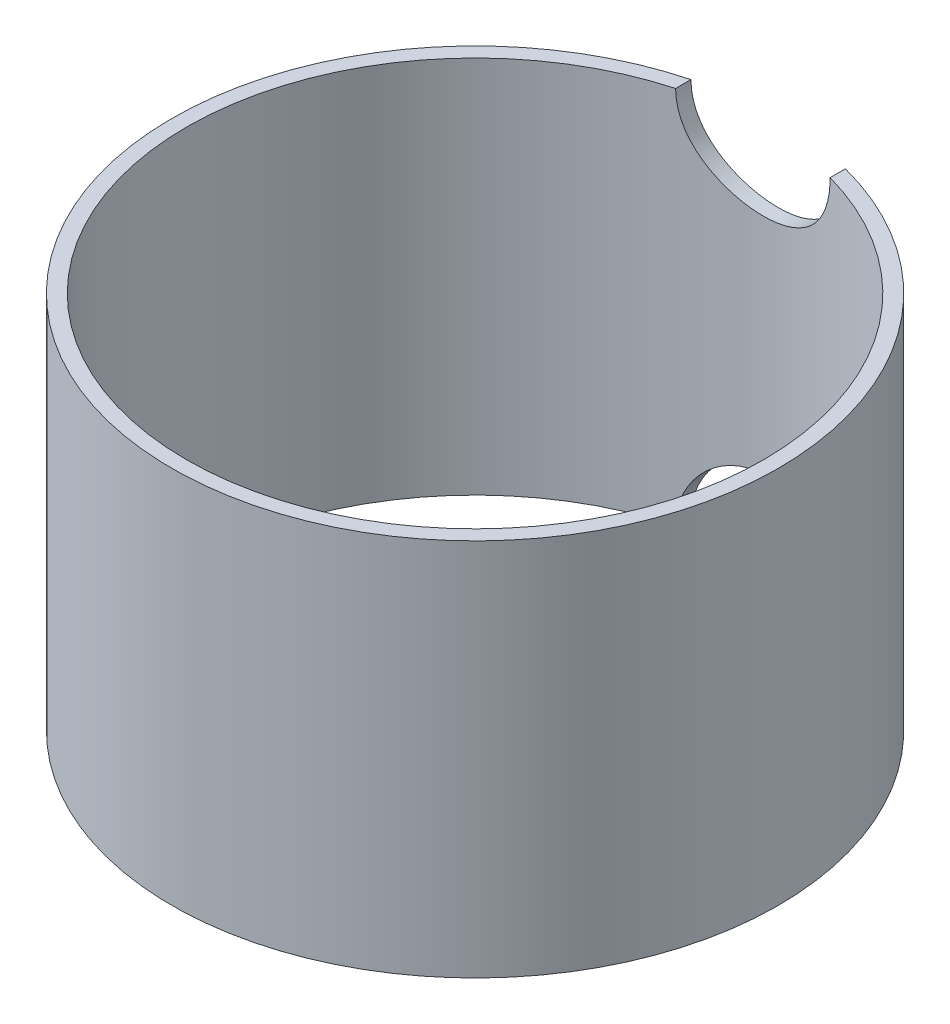
ISO-10303-21;
HEADER;
FILE_DESCRIPTION(('STEP AP214'),'2;1');
FILE_NAME('part.step','',(''),(''),'','','');
FILE_SCHEMA(('AUTOMOTIVE_DESIGN { 1 0 10303 214 1 1 1 1 }'));
ENDSEC;
DATA;
#1=APPLICATION_CONTEXT('core data for automotive mechanical design processes');
#2=APPLICATION_PROTOCOL_DEFINITION('international standard','automotive_design',2000,#1);
#3=PRODUCT_CONTEXT('',#1,'mechanical');
#4=PRODUCT('Part','Part','',(#3));
#5=PRODUCT_RELATED_PRODUCT_CATEGORY('part','',(#4));
#6=PRODUCT_DEFINITION_FORMATION('','',#4);
#7=PRODUCT_DEFINITION_CONTEXT('part definition',#1,'design');
#8=PRODUCT_DEFINITION('design','',#6,#7);
#9=PRODUCT_DEFINITION_SHAPE('','',#8);
#10=(LENGTH_UNIT() NAMED_UNIT(*) SI_UNIT(.MILLI.,.METRE.));
#11=(NAMED_UNIT(*) PLANE_ANGLE_UNIT() SI_UNIT($,.RADIAN.));
#12=(NAMED_UNIT(*) SI_UNIT($,.STERADIAN.) SOLID_ANGLE_UNIT());
#13=UNCERTAINTY_MEASURE_WITH_UNIT(LENGTH_MEASURE(1.E-05),#10,'distance_accuracy_value','');
#14=(GEOMETRIC_REPRESENTATION_CONTEXT(3) GLOBAL_UNCERTAINTY_ASSIGNED_CONTEXT((#13)) GLOBAL_UNIT_ASSIGNED_CONTEXT((#10,
#11,#12)) REPRESENTATION_CONTEXT('',''));
#15=CARTESIAN_POINT('',(0.,0.,0.));
#16=DIRECTION('',(0.,0.,1.));
#17=DIRECTION('',(1.,0.,0.));
#18=AXIS2_PLACEMENT_3D('',#15,#16,#17);
#19=CARTESIAN_POINT('',(0.,51.2,0.));
#20=DIRECTION('',(0.,1.,0.));
#21=DIRECTION('',(0.,0.,1.));
#22=AXIS2_PLACEMENT_3D('',#19,#20,#21);
#23=PLANE('',#22);
#24=DIRECTION('',(0.,0.,1.));
#25=VECTOR('',#24,1.);
#26=CARTESIAN_POINT('',(-10.45,51.2,-41.));
#27=LINE('',#26,#25);
#28=CARTESIAN_POINT('',(-10.45,51.2,-39.645901427512));
#29=VERTEX_POINT('',#28);
#30=CARTESIAN_POINT('',(-10.45,51.2,-37.5738938626275));
#31=VERTEX_POINT('',#30);
#32=EDGE_CURVE('E62',#29,#31,#27,.T.);
#33=ORIENTED_EDGE('',*,*,#32,.F.);
#34=CARTESIAN_POINT('',(0.,51.2,0.));
#35=DIRECTION('',(0.,1.,0.));
#36=DIRECTION('',(0.,0.,1.));
#37=AXIS2_PLACEMENT_3D('',#34,#35,#36);
#38=CIRCLE('',#37,41.);
#39=CARTESIAN_POINT('',(10.45,51.2,-39.645901427512));
#40=VERTEX_POINT('',#39);
#41=EDGE_CURVE('E85',#29,#40,#38,.T.);
#42=ORIENTED_EDGE('',*,*,#41,.T.);
#43=DIRECTION('',(0.,0.,1.));
#44=VECTOR('',#43,1.);
#45=CARTESIAN_POINT('',(10.45,51.2,-41.));
#46=LINE('',#45,#44);
#47=CARTESIAN_POINT('',(10.45,51.2,-37.5738938626275));
#48=VERTEX_POINT('',#47);
#49=EDGE_CURVE('E121',#48,#40,#46,.F.);
#50=ORIENTED_EDGE('',*,*,#49,.F.);
#51=CARTESIAN_POINT('',(0.,51.2,0.));
#52=DIRECTION('',(0.,1.,0.));
#53=DIRECTION('',(0.,0.,1.));
#54=AXIS2_PLACEMENT_3D('',#51,#52,#53);
#55=CIRCLE('',#54,39.);
#56=EDGE_CURVE('E94',#31,#48,#55,.T.);
#57=ORIENTED_EDGE('',*,*,#56,.F.);
#58=EDGE_LOOP('',(#33,#42,#50,#57));
#59=FACE_BOUND('',#58,.T.);
#60=ADVANCED_FACE('F33',(#59),#23,.T.);
#61=CARTESIAN_POINT('',(0.,0.,0.));
#62=DIRECTION('',(0.,1.,0.));
#63=DIRECTION('',(0.,0.,1.));
#64=AXIS2_PLACEMENT_3D('',#61,#62,#63);
#65=PLANE('',#64);
#66=CARTESIAN_POINT('',(0.,0.,0.));
#67=DIRECTION('',(0.,1.,0.));
#68=DIRECTION('',(0.,0.,1.));
#69=AXIS2_PLACEMENT_3D('',#66,#67,#68);
#70=CIRCLE('',#69,41.);
#71=CARTESIAN_POINT('',(-10.45,0.,-39.645901427512));
#72=VERTEX_POINT('',#71);
#73=CARTESIAN_POINT('',(10.45,0.,-39.645901427512));
#74=VERTEX_POINT('',#73);
#75=EDGE_CURVE('E90',#72,#74,#70,.T.);
#76=ORIENTED_EDGE('',*,*,#75,.F.);
#77=DIRECTION('',(0.,0.,1.));
#78=VECTOR('',#77,1.);
#79=CARTESIAN_POINT('',(-10.45,0.,-41.));
#80=LINE('',#79,#78);
#81=CARTESIAN_POINT('',(-10.45,0.,-37.5738938626275));
#82=VERTEX_POINT('',#81);
#83=EDGE_CURVE('E80',#72,#82,#80,.T.);
#84=ORIENTED_EDGE('',*,*,#83,.T.);
#85=CARTESIAN_POINT('',(0.,0.,0.));
#86=DIRECTION('',(0.,1.,0.));
#87=DIRECTION('',(0.,0.,1.));
#88=AXIS2_PLACEMENT_3D('',#85,#86,#87);
#89=CIRCLE('',#88,39.);
#90=CARTESIAN_POINT('',(10.45,0.,-37.5738938626275));
#91=VERTEX_POINT('',#90);
#92=EDGE_CURVE('E88',#82,#91,#89,.T.);
#93=ORIENTED_EDGE('',*,*,#92,.T.);
#94=DIRECTION('',(0.,0.,1.));
#95=VECTOR('',#94,1.);
#96=CARTESIAN_POINT('',(10.45,0.,-41.));
#97=LINE('',#96,#95);
#98=EDGE_CURVE('E55',#91,#74,#97,.F.);
#99=ORIENTED_EDGE('',*,*,#98,.T.);
#100=EDGE_LOOP('',(#76,#84,#93,#99));
#101=FACE_BOUND('',#100,.T.);
#102=ADVANCED_FACE('F87',(#101),#65,.F.);
#103=CARTESIAN_POINT('',(0.,51.2,0.));
#104=DIRECTION('',(0.,-1.,0.));
#105=DIRECTION('',(0.,0.,-1.));
#106=AXIS2_PLACEMENT_3D('',#103,#104,#105);
#107=CYLINDRICAL_SURFACE('',#106,41.);
#108=ORIENTED_EDGE('',*,*,#41,.F.);
#109=CARTESIAN_POINT('',(-10.45,51.2,-39.645901427512));
#110=CARTESIAN_POINT('',(-10.4500368438836,50.9112052604951,-39.6458673603376));
#111=CARTESIAN_POINT('',(-10.4380300101083,50.6224224584076,-39.6490558010595));
#112=CARTESIAN_POINT('',(-10.3902001444511,50.0470202026528,-39.6616296629602));
#113=CARTESIAN_POINT('',(-10.3543812384641,49.7604003829073,-39.6710140105781));
#114=CARTESIAN_POINT('',(-10.2592945990659,49.1919382980589,-39.6957067801007));
#115=CARTESIAN_POINT('',(-10.2000745031508,48.9100875326951,-39.71100316557));
#116=CARTESIAN_POINT('',(-10.0586911320703,48.3525576093135,-39.7470512718942));
#117=CARTESIAN_POINT('',(-9.97652751652669,48.0768785429214,-39.7678030736826));
#118=CARTESIAN_POINT('',(-9.78994846095404,47.5336864705125,-39.8141448004812));
#119=CARTESIAN_POINT('',(-9.6855406114894,47.2661707143794,-39.8397330747708));
#120=CARTESIAN_POINT('',(-9.45521632135085,46.7408903456132,-39.8950236129089));
#121=CARTESIAN_POINT('',(-9.32929179059307,46.4831294454109,-39.9247274233655));
#122=CARTESIAN_POINT('',(-9.05690279276873,45.9791721920817,-39.987398369575));
#123=CARTESIAN_POINT('',(-8.91044154116916,45.7329740365979,-40.0203649942267));
#124=CARTESIAN_POINT('',(-8.59791187283406,45.2535444283777,-40.088670455776));
#125=CARTESIAN_POINT('',(-8.43183448330955,45.0203189819078,-40.1240103750495));
#126=CARTESIAN_POINT('',(-8.07763531389647,44.56377522658,-40.196830133563));
#127=CARTESIAN_POINT('',(-7.88913164319508,44.3407577393893,-40.234338979343));
#128=CARTESIAN_POINT('',(-7.49425670673086,43.9114027474804,-40.3097567874696));
#129=CARTESIAN_POINT('',(-7.28789316603187,43.7050581050729,-40.3476655706594));
#130=CARTESIAN_POINT('',(-6.8584514481281,43.3101788455125,-40.4228793953211));
#131=CARTESIAN_POINT('',(-6.63536381707102,43.1216544400603,-40.4601840805966));
#132=CARTESIAN_POINT('',(-6.17411038141599,42.7638861146497,-40.5331327472467));
#133=CARTESIAN_POINT('',(-5.93595027730379,42.5946349724423,-40.5687773477242));
#134=CARTESIAN_POINT('',(-5.44240328793721,42.274161742658,-40.6379531803324));
#135=CARTESIAN_POINT('',(-5.18681396053993,42.1232427717348,-40.6714454351166));
#136=CARTESIAN_POINT('',(-4.66336344310647,41.8435262277956,-40.7347828592638));
#137=CARTESIAN_POINT('',(-4.39550209647532,41.714728937159,-40.7646279820703));
#138=CARTESIAN_POINT('',(-3.84942935533693,41.4802950055813,-40.8198135830379));
#139=CARTESIAN_POINT('',(-3.57121970225033,41.3746544882415,-40.8451548150069));
#140=CARTESIAN_POINT('',(-3.00641768536695,41.187384769855,-40.8906065529402));
#141=CARTESIAN_POINT('',(-2.71982552510235,41.1057549863449,-40.9107171857892));
#142=CARTESIAN_POINT('',(-2.14647395602521,40.968665848,-40.9447601292532));
#143=CARTESIAN_POINT('',(-1.85984450341102,40.9126928069987,-40.9588133406824));
#144=CARTESIAN_POINT('',(-1.28267980982847,40.8249128268876,-40.9809483195822));
#145=CARTESIAN_POINT('',(-0.992144618224663,40.7931055826386,-40.9890301624527));
#146=CARTESIAN_POINT('',(-0.409357337753071,40.7539379778427,-40.9989920863706));
#147=CARTESIAN_POINT('',(-0.11710544385622,40.7465748928941,-41.0008728585527));
#148=CARTESIAN_POINT('',(0.466959268206283,40.7563534868606,-40.9983808106222));
#149=CARTESIAN_POINT('',(0.758772092001783,40.7734948488473,-40.9940080713895));
#150=CARTESIAN_POINT('',(1.33306338718484,40.8314511823888,-40.9793062984528));
#151=CARTESIAN_POINT('',(1.61560176819125,40.8717101486429,-40.9691171880145));
#152=CARTESIAN_POINT('',(2.17618838022974,40.9751312748661,-40.9431671621998));
#153=CARTESIAN_POINT('',(2.45423669213015,41.0382930218634,-40.9274063472897));
#154=CARTESIAN_POINT('',(3.0039335559681,41.1870105109195,-40.8907357580868));
#155=CARTESIAN_POINT('',(3.27558195151647,41.2725667995967,-40.8698258581128));
#156=CARTESIAN_POINT('',(3.81064880176692,41.4654054893222,-40.8234133585548));
#157=CARTESIAN_POINT('',(4.07406713611667,41.5726882079154,-40.7979106918452));
#158=CARTESIAN_POINT('',(4.59330956807969,41.8092522749408,-40.7427330805346));
#159=CARTESIAN_POINT('',(4.84904243538839,41.9387254266181,-40.7130221876318));
#160=CARTESIAN_POINT('',(5.34880281689805,42.2180853724138,-40.6503845271063));
#161=CARTESIAN_POINT('',(5.59282624526163,42.3679792229951,-40.6174566489577));
#162=CARTESIAN_POINT('',(6.06752137923254,42.6870995238963,-40.5492624752319));
#163=CARTESIAN_POINT('',(6.29819367604059,42.8563251172001,-40.513996283346));
#164=CARTESIAN_POINT('',(6.74476459762284,43.2129908961554,-40.4420488243379));
#165=CARTESIAN_POINT('',(6.96066291731456,43.4004314577525,-40.4053675280182));
#166=CARTESIAN_POINT('',(7.38220696633468,43.7978532389637,-40.3305112330858));
#167=CARTESIAN_POINT('',(7.58739198178297,44.0083209914532,-40.2923232799351));
#168=CARTESIAN_POINT('',(7.97929785420182,44.445777547647,-40.2165468372802));
#169=CARTESIAN_POINT('',(8.16602433951857,44.6727612784481,-40.1789581679935));
#170=CARTESIAN_POINT('',(8.51989710492811,45.1419288101288,-40.1054115787501));
#171=CARTESIAN_POINT('',(8.68703438068663,45.3841195230781,-40.0694544133447));
#172=CARTESIAN_POINT('',(9.00044097122405,45.8820035386886,-40.0002228413847));
#173=CARTESIAN_POINT('',(9.14671094345448,46.1376964155986,-39.9669483503232));
#174=CARTESIAN_POINT('',(9.4180919156905,46.6624026629019,-39.9038729525829));
#175=CARTESIAN_POINT('',(9.54307485926258,46.9314848780428,-39.8740933819395));
#176=CARTESIAN_POINT('',(9.76984382352378,47.4796996933297,-39.8191382753024));
#177=CARTESIAN_POINT('',(9.87163087619826,47.7588318457138,-39.793962534494));
#178=CARTESIAN_POINT('',(10.0510573661207,48.3248010555536,-39.749022657032));
#179=CARTESIAN_POINT('',(10.1287260750808,48.6116283105045,-39.7292519639487));
#180=CARTESIAN_POINT('',(10.2593799182673,49.1910753064094,-39.695713469014));
#181=CARTESIAN_POINT('',(10.3123765990126,49.483692270797,-39.681942859315));
#182=CARTESIAN_POINT('',(10.3851732873343,50.0137306686374,-39.6629465784739));
#183=CARTESIAN_POINT('',(10.4094899513117,50.2505009897932,-39.6565634554929));
#184=CARTESIAN_POINT('',(10.4418972787809,50.7248409848075,-39.6480369867694));
#185=CARTESIAN_POINT('',(10.4500140403579,50.9624087543712,-39.6458868217967));
#186=CARTESIAN_POINT('',(10.45,51.2,-39.645901427512));
#187=B_SPLINE_CURVE_WITH_KNOTS('',3,(#109,#110,#111,#112,#113,#114,#115,#116,#117,#118,#119,
#120,#121,#122,#123,#124,#125,#126,#127,#128,#129,#130,#131,#132,#133,#134,#135,#136,#137,#138,
#139,#140,#141,#142,#143,#144,#145,#146,#147,#148,#149,#150,#151,#152,#153,#154,#155,#156,#157,
#158,#159,#160,#161,#162,#163,#164,#165,#166,#167,#168,#169,#170,#171,#172,#173,#174,#175,#176,
#177,#178,#179,#180,#181,#182,#183,#184,#185,#186),.UNSPECIFIED.,.F.,.F.,(4,2,2,2,2,2,2,2,2,2,2,
2,2,2,2,2,2,2,2,2,2,2,2,2,2,2,2,2,2,2,2,2,2,2,2,2,2,2,4),(0.,0.866098913349945,1.73204779767159,
2.59624288810411,3.46045079997393,4.32436428277422,5.18860330713596,6.05270716700357,
6.9172078261263,7.7994179740568,8.6812484220814,9.56358116869111,10.4455821840423,
11.340606711544,12.2356426630338,13.1305286726455,14.0253929719091,14.9014609538454,
15.7775178735676,16.653477149878,17.5294250970688,18.3851387140813,19.2408369020506,
20.0965559783279,20.9522875623638,21.8158276420485,22.6796668823168,23.5434678416574,
24.407286633101,25.295461257298,26.1833642198615,27.0716737265295,27.959955239668,
28.853404868785,29.7468147405574,30.6391360308962,31.531039293664,32.2447706514485,
32.9573512550355),.UNSPECIFIED.);
#188=EDGE_CURVE('E95',#29,#40,#187,.T.);
#189=ORIENTED_EDGE('',*,*,#188,.T.);
#190=EDGE_LOOP('',(#108,#189));
#191=FACE_BOUND('',#190,.T.);
#192=ORIENTED_EDGE('',*,*,#75,.T.);
#193=CARTESIAN_POINT('',(10.45,0.,-39.645901427512));
#194=CARTESIAN_POINT('',(10.4500368438836,0.288794739504853,-39.6458673603376));
#195=CARTESIAN_POINT('',(10.4380300101083,0.577577541592381,-39.6490558010595));
#196=CARTESIAN_POINT('',(10.3902001444511,1.15297979734717,-39.6616296629602));
#197=CARTESIAN_POINT('',(10.3543812384641,1.43959961709271,-39.6710140105781));
#198=CARTESIAN_POINT('',(10.2592945990659,2.00806170194108,-39.6957067801007));
#199=CARTESIAN_POINT('',(10.2000745031508,2.28991246730492,-39.71100316557));
#200=CARTESIAN_POINT('',(10.0586911320703,2.84744239068655,-39.7470512718942));
#201=CARTESIAN_POINT('',(9.97652751652669,3.12312145707862,-39.7678030736826));
#202=CARTESIAN_POINT('',(9.78994846095404,3.66631352948751,-39.8141448004812));
#203=CARTESIAN_POINT('',(9.6855406114894,3.93382928562062,-39.8397330747708));
#204=CARTESIAN_POINT('',(9.45521632135085,4.45910965438679,-39.8950236129089));
#205=CARTESIAN_POINT('',(9.32929179059307,4.71687055458913,-39.9247274233655));
#206=CARTESIAN_POINT('',(9.05690279276873,5.22082780791828,-39.987398369575));
#207=CARTESIAN_POINT('',(8.91044154116916,5.4670259634021,-40.0203649942267));
#208=CARTESIAN_POINT('',(8.59791187283407,5.94645557162233,-40.088670455776));
#209=CARTESIAN_POINT('',(8.43183448330955,6.17968101809217,-40.1240103750495));
#210=CARTESIAN_POINT('',(8.07763531389647,6.63622477342002,-40.196830133563));
#211=CARTESIAN_POINT('',(7.88913164319508,6.85924226061073,-40.234338979343));
#212=CARTESIAN_POINT('',(7.49425670673087,7.28859725251964,-40.3097567874696));
#213=CARTESIAN_POINT('',(7.28789316603187,7.49494189492715,-40.3476655706594));
#214=CARTESIAN_POINT('',(6.8584514481281,7.8898211544875,-40.4228793953211));
#215=CARTESIAN_POINT('',(6.63536381707103,8.07834555993972,-40.4601840805966));
#216=CARTESIAN_POINT('',(6.174110381416,8.43611388535035,-40.5331327472467));
#217=CARTESIAN_POINT('',(5.93595027730379,8.60536502755768,-40.5687773477242));
#218=CARTESIAN_POINT('',(5.44240328793721,8.92583825734205,-40.6379531803324));
#219=CARTESIAN_POINT('',(5.18681396053993,9.07675722826524,-40.6714454351166));
#220=CARTESIAN_POINT('',(4.66336344310647,9.35647377220445,-40.7347828592638));
#221=CARTESIAN_POINT('',(4.39550209647532,9.48527106284097,-40.7646279820703));
#222=CARTESIAN_POINT('',(3.84942935533693,9.71970499441874,-40.8198135830379));
#223=CARTESIAN_POINT('',(3.57121970225033,9.82534551175852,-40.8451548150069));
#224=CARTESIAN_POINT('',(3.00641768536695,10.012615230145,-40.8906065529402));
#225=CARTESIAN_POINT('',(2.71982552510235,10.0942450136552,-40.9107171857892));
#226=CARTESIAN_POINT('',(2.14647395602521,10.231334152,-40.9447601292532));
#227=CARTESIAN_POINT('',(1.85984450341102,10.2873071930013,-40.9588133406824));
#228=CARTESIAN_POINT('',(1.28267980982847,10.3750871731124,-40.9809483195822));
#229=CARTESIAN_POINT('',(0.992144618224661,10.4068944173614,-40.9890301624527));
#230=CARTESIAN_POINT('',(0.409357337753068,10.4460620221573,-40.9989920863706));
#231=CARTESIAN_POINT('',(0.117105443856216,10.4534251071059,-41.0008728585527));
#232=CARTESIAN_POINT('',(-0.466959268206286,10.4436465131394,-40.9983808106222));
#233=CARTESIAN_POINT('',(-0.758772092001787,10.4265051511527,-40.9940080713895));
#234=CARTESIAN_POINT('',(-1.33306338718485,10.3685488176112,-40.9793062984528));
#235=CARTESIAN_POINT('',(-1.61560176819125,10.3282898513571,-40.9691171880145));
#236=CARTESIAN_POINT('',(-2.17618838022974,10.2248687251339,-40.9431671621998));
#237=CARTESIAN_POINT('',(-2.45423669213014,10.1617069781366,-40.9274063472897));
#238=CARTESIAN_POINT('',(-3.0039335559681,10.0129894890805,-40.8907357580868));
#239=CARTESIAN_POINT('',(-3.27558195151648,9.92743320040326,-40.8698258581128));
#240=CARTESIAN_POINT('',(-3.81064880176692,9.73459451067779,-40.8234133585548));
#241=CARTESIAN_POINT('',(-4.07406713611667,9.62731179208457,-40.7979106918452));
#242=CARTESIAN_POINT('',(-4.5933095680797,9.39074772505925,-40.7427330805346));
#243=CARTESIAN_POINT('',(-4.84904243538839,9.26127457338186,-40.7130221876318));
#244=CARTESIAN_POINT('',(-5.34880281689806,8.98191462758621,-40.6503845271063));
#245=CARTESIAN_POINT('',(-5.59282624526164,8.83202077700494,-40.6174566489577));
#246=CARTESIAN_POINT('',(-6.06752137923255,8.51290047610375,-40.5492624752319));
#247=CARTESIAN_POINT('',(-6.29819367604059,8.34367488279993,-40.513996283346));
#248=CARTESIAN_POINT('',(-6.74476459762285,7.9870091038446,-40.4420488243379));
#249=CARTESIAN_POINT('',(-6.96066291731456,7.79956854224746,-40.4053675280182));
#250=CARTESIAN_POINT('',(-7.38220696633468,7.40214676103632,-40.3305112330858));
#251=CARTESIAN_POINT('',(-7.58739198178297,7.19167900854678,-40.2923232799351));
#252=CARTESIAN_POINT('',(-7.97929785420183,6.75422245235297,-40.2165468372802));
#253=CARTESIAN_POINT('',(-8.16602433951858,6.52723872155191,-40.1789581679935));
#254=CARTESIAN_POINT('',(-8.51989710492812,6.05807118987121,-40.1054115787501));
#255=CARTESIAN_POINT('',(-8.68703438068663,5.81588047692188,-40.0694544133447));
#256=CARTESIAN_POINT('',(-9.00044097122405,5.31799646131141,-40.0002228413847));
#257=CARTESIAN_POINT('',(-9.14671094345448,5.06230358440142,-39.9669483503232));
#258=CARTESIAN_POINT('',(-9.4180919156905,4.53759733709806,-39.9038729525829));
#259=CARTESIAN_POINT('',(-9.54307485926259,4.26851512195719,-39.8740933819395));
#260=CARTESIAN_POINT('',(-9.76984382352378,3.72030030667032,-39.8191382753024));
#261=CARTESIAN_POINT('',(-9.87163087619826,3.44116815428618,-39.793962534494));
#262=CARTESIAN_POINT('',(-10.0510573661208,2.87519894444637,-39.749022657032));
#263=CARTESIAN_POINT('',(-10.1287260750808,2.58837168949553,-39.7292519639487));
#264=CARTESIAN_POINT('',(-10.2593799182673,2.00892469359058,-39.695713469014));
#265=CARTESIAN_POINT('',(-10.3123765990126,1.71630772920302,-39.681942859315));
#266=CARTESIAN_POINT('',(-10.3851732873343,1.18626933136262,-39.6629465784739));
#267=CARTESIAN_POINT('',(-10.4094899513117,0.949499010206785,-39.6565634554929));
#268=CARTESIAN_POINT('',(-10.4418972787809,0.475159015192538,-39.6480369867694));
#269=CARTESIAN_POINT('',(-10.4500140403579,0.237591245628837,-39.6458868217967));
#270=CARTESIAN_POINT('',(-10.45,0.,-39.645901427512));
#271=B_SPLINE_CURVE_WITH_KNOTS('',3,(#193,#194,#195,#196,#197,#198,#199,#200,#201,#202,#203,
#204,#205,#206,#207,#208,#209,#210,#211,#212,#213,#214,#215,#216,#217,#218,#219,#220,#221,#222,
#223,#224,#225,#226,#227,#228,#229,#230,#231,#232,#233,#234,#235,#236,#237,#238,#239,#240,#241,
#242,#243,#244,#245,#246,#247,#248,#249,#250,#251,#252,#253,#254,#255,#256,#257,#258,#259,#260,
#261,#262,#263,#264,#265,#266,#267,#268,#269,#270),.UNSPECIFIED.,.F.,.F.,(4,2,2,2,2,2,2,2,2,2,2,
2,2,2,2,2,2,2,2,2,2,2,2,2,2,2,2,2,2,2,2,2,2,2,2,2,2,2,4),(0.,0.866098913349945,1.7320477976716,
2.59624288810411,3.46045079997393,4.32436428277422,5.18860330713596,6.05270716700358,
6.91720782612631,7.7994179740568,8.68124842208141,9.5635811686911,10.4455821840423,
11.340606711544,12.2356426630338,13.1305286726455,14.0253929719091,14.9014609538454,
15.7775178735677,16.653477149878,17.5294250970688,18.3851387140813,19.2408369020506,
20.0965559783279,20.9522875623638,21.8158276420485,22.6796668823168,23.5434678416574,
24.407286633101,25.295461257298,26.1833642198615,27.0716737265295,27.959955239668,
28.853404868785,29.7468147405574,30.6391360308962,31.531039293664,32.2447706514485,
32.9573512550355),.UNSPECIFIED.);
#272=EDGE_CURVE('E91',#74,#72,#271,.T.);
#273=ORIENTED_EDGE('',*,*,#272,.T.);
#274=EDGE_LOOP('',(#192,#273));
#275=FACE_BOUND('',#274,.T.);
#276=ADVANCED_FACE('F35',(#191,#275),#107,.T.);
#277=CARTESIAN_POINT('',(0.,51.2,0.));
#278=DIRECTION('',(0.,-1.,0.));
#279=DIRECTION('',(0.,0.,-1.));
#280=AXIS2_PLACEMENT_3D('',#277,#278,#279);
#281=CYLINDRICAL_SURFACE('',#280,39.);
#282=CARTESIAN_POINT('',(-10.45,51.2,-37.5738938626275));
#283=CARTESIAN_POINT('',(-10.4500373920709,50.9117491083462,-37.5738577903348));
#284=CARTESIAN_POINT('',(-10.4380750900914,50.6235109736397,-37.5772096511429));
#285=CARTESIAN_POINT('',(-10.3904267658209,50.0492048806012,-37.5904264048467));
#286=CARTESIAN_POINT('',(-10.3547451827669,49.7631365263099,-37.6002900790066));
#287=CARTESIAN_POINT('',(-10.2600363187395,49.1958194785899,-37.6262397112694));
#288=CARTESIAN_POINT('',(-10.201059704351,48.914561698183,-37.6423121636508));
#289=CARTESIAN_POINT('',(-10.0602723818592,48.3582146776707,-37.6801839589875));
#290=CARTESIAN_POINT('',(-9.97846126571851,48.0831255478898,-37.70198340428));
#291=CARTESIAN_POINT('',(-9.79270803170171,47.541118802675,-37.7506564741922));
#292=CARTESIAN_POINT('',(-9.68877496871096,47.2741978948248,-37.7775280222069));
#293=CARTESIAN_POINT('',(-9.45952074738847,46.7500769913891,-37.8355844066197));
#294=CARTESIAN_POINT('',(-9.33419153799918,46.492880699697,-37.8667708658155));
#295=CARTESIAN_POINT('',(-9.06310545558155,45.9899895073372,-37.9325659606546));
#296=CARTESIAN_POINT('',(-8.91735082992565,45.7442933452927,-37.9671742196801));
#297=CARTESIAN_POINT('',(-8.6063444694761,45.2657943164186,-38.0388788488303));
#298=CARTESIAN_POINT('',(-8.44108380251953,45.0329974286554,-38.0759763554443));
#299=CARTESIAN_POINT('',(-8.08825192538371,44.5767288419915,-38.1525030749824));
#300=CARTESIAN_POINT('',(-7.90025993568541,44.3535880945947,-38.1919660792141));
#301=CARTESIAN_POINT('',(-7.50641503261475,43.9239345577609,-38.2713216243548));
#302=CARTESIAN_POINT('',(-7.30056979761296,43.7174146929281,-38.3112139742069));
#303=CARTESIAN_POINT('',(-6.87215594529443,43.3221216081399,-38.390375612173));
#304=CARTESIAN_POINT('',(-6.6495778480358,43.1333585866765,-38.4296445315929));
#305=CARTESIAN_POINT('',(-6.18931626576442,42.7750436148559,-38.5064510149797));
#306=CARTESIAN_POINT('',(-5.95163849108334,42.6054844687731,-38.5439892242997));
#307=CARTESIAN_POINT('',(-5.45861259014551,42.2840559977579,-38.6169217750298));
#308=CARTESIAN_POINT('',(-5.20303841137456,42.1325228253616,-38.6522707976042));
#309=CARTESIAN_POINT('',(-4.6795159575024,41.8515840617272,-38.7191394205522));
#310=CARTESIAN_POINT('',(-4.41156750690842,41.7221787844309,-38.7506589665928));
#311=CARTESIAN_POINT('',(-3.86521809590413,41.4865518440306,-38.808962101489));
#312=CARTESIAN_POINT('',(-3.58681901320603,41.380326039313,-38.8357465362324));
#313=CARTESIAN_POINT('',(-3.02153667696182,41.1919248430342,-38.883811073634));
#314=CARTESIAN_POINT('',(-2.73465365221985,41.1097488035229,-38.9050913245845));
#315=CARTESIAN_POINT('',(-2.16124596868057,40.9717814141104,-38.941104548425));
#316=CARTESIAN_POINT('',(-1.87486615676167,40.9154243551832,-38.9559774259799));
#317=CARTESIAN_POINT('',(-1.29814345111737,40.8268407731413,-38.9794574546225));
#318=CARTESIAN_POINT('',(-1.00780061256513,40.7946139144347,-38.9880646928499));
#319=CARTESIAN_POINT('',(-0.425352780422653,40.7545810326776,-38.9987679865144));
#320=CARTESIAN_POINT('',(-0.133248011649203,40.7467719573824,-39.0008648557534));
#321=CARTESIAN_POINT('',(0.450560700083244,40.7556369695334,-38.998489709896));
#322=CARTESIAN_POINT('',(0.742264648747831,40.7723107047812,-38.9940177892952));
#323=CARTESIAN_POINT('',(1.31566789482435,40.829252605249,-38.9788298426001));
#324=CARTESIAN_POINT('',(1.59743259409284,40.8689080885779,-38.9682759972049));
#325=CARTESIAN_POINT('',(2.15651625867978,40.9709881176464,-38.9413374533237));
#326=CARTESIAN_POINT('',(2.43383531249339,41.0334122095643,-38.9249528710555));
#327=CARTESIAN_POINT('',(2.98212785740405,41.1805197497266,-38.8867900921682));
#328=CARTESIAN_POINT('',(3.25310118877777,41.265203757604,-38.8650117599465));
#329=CARTESIAN_POINT('',(3.7868852975127,41.456163406933,-38.8166372330642));
#330=CARTESIAN_POINT('',(4.04969594535907,41.5624393907765,-38.7900409620044));
#331=CARTESIAN_POINT('',(4.56798278338126,41.7969298139873,-38.7324436470119));
#332=CARTESIAN_POINT('',(4.82336153066072,41.9253495597617,-38.701401889635));
#333=CARTESIAN_POINT('',(5.32250249464289,42.202501054026,-38.6359205568874));
#334=CARTESIAN_POINT('',(5.56626065995522,42.3512398176634,-38.6014798091589));
#335=CARTESIAN_POINT('',(6.04053849063783,42.6679600431494,-38.5301104349061));
#336=CARTESIAN_POINT('',(6.27105853042812,42.8359409603602,-38.4931818788099));
#337=CARTESIAN_POINT('',(6.71745548670718,43.1900398743007,-38.4177959048086));
#338=CARTESIAN_POINT('',(6.93333206692629,43.3761582872973,-38.3793384518264));
#339=CARTESIAN_POINT('',(7.35558499466213,43.7714016685751,-38.3006908440009));
#340=CARTESIAN_POINT('',(7.56145753374542,43.9810619022887,-38.2604839857264));
#341=CARTESIAN_POINT('',(7.95481086713835,44.4169591333522,-38.1806398607475));
#342=CARTESIAN_POINT('',(8.14229722347866,44.6431910811654,-38.1410024249026));
#343=CARTESIAN_POINT('',(8.4977668149349,45.1109293996089,-38.0633824155202));
#344=CARTESIAN_POINT('',(8.66574103542037,45.3524427513004,-38.0254006119094));
#345=CARTESIAN_POINT('',(8.98089619917667,45.8490665329513,-37.9522026295156));
#346=CARTESIAN_POINT('',(9.12807778870539,46.1041765399722,-37.9169863647916));
#347=CARTESIAN_POINT('',(9.4015000305453,46.6281065679616,-37.8501222440888));
#348=CARTESIAN_POINT('',(9.52758948951678,46.8970089062559,-37.8185006326935));
#349=CARTESIAN_POINT('',(9.75657435446192,47.4450121387436,-37.7600745381941));
#350=CARTESIAN_POINT('',(9.85947084864728,47.7241125537299,-37.7332698290934));
#351=CARTESIAN_POINT('',(10.0410966710384,48.2901680252034,-37.6853446660831));
#352=CARTESIAN_POINT('',(10.11985535131,48.5771130760217,-37.66421731228));
#353=CARTESIAN_POINT('',(10.2526483430768,49.1569365116391,-37.6282862538017));
#354=CARTESIAN_POINT('',(10.3066941730884,49.4498120656549,-37.6134796032975));
#355=CARTESIAN_POINT('',(10.3820563744742,49.9856406262467,-37.5927411611194));
#356=CARTESIAN_POINT('',(10.407540555675,50.2279728410177,-37.5856842636542));
#357=CARTESIAN_POINT('',(10.4415070574466,50.7135301584575,-37.5762556688693));
#358=CARTESIAN_POINT('',(10.4500162129729,50.9567532419112,-37.5738765767309));
#359=CARTESIAN_POINT('',(10.45,51.2,-37.5738938626275));
#360=B_SPLINE_CURVE_WITH_KNOTS('',3,(#282,#283,#284,#285,#286,#287,#288,#289,#290,#291,#292,
#293,#294,#295,#296,#297,#298,#299,#300,#301,#302,#303,#304,#305,#306,#307,#308,#309,#310,#311,
#312,#313,#314,#315,#316,#317,#318,#319,#320,#321,#322,#323,#324,#325,#326,#327,#328,#329,#330,
#331,#332,#333,#334,#335,#336,#337,#338,#339,#340,#341,#342,#343,#344,#345,#346,#347,#348,#349,
#350,#351,#352,#353,#354,#355,#356,#357,#358,#359),.UNSPECIFIED.,.F.,.F.,(4,2,2,2,2,2,2,2,2,2,2,
2,2,2,2,2,2,2,2,2,2,2,2,2,2,2,2,2,2,2,2,2,2,2,2,2,2,2,4),(0.,0.86446555364706,1.7287693617797,
2.59120357406108,3.45365319845301,4.31575048423307,5.17817288253662,6.04050046442322,
6.90322446468157,7.78550244376317,8.66740283439857,9.54980668343005,10.4318787926017,
11.3284333784159,12.2250006831362,13.1214076614545,14.0177904865056,14.8934639851426,
15.7691253050808,16.6446771621952,17.5202164241502,18.3734229223376,19.2266124154238,
20.0798233604584,20.9330478362271,21.7946561007941,22.6565625912542,23.5184446919972,
24.3803465781431,25.2690368140743,26.1574573763287,27.0462867710988,27.9350885339921,
28.8300111715943,29.7248918107669,30.6186798995133,31.5120509730948,32.2427420988201,
32.9722771938146),.UNSPECIFIED.);
#361=EDGE_CURVE('E11',#31,#48,#360,.T.);
#362=ORIENTED_EDGE('',*,*,#361,.F.);
#363=ORIENTED_EDGE('',*,*,#56,.T.);
#364=EDGE_LOOP('',(#362,#363));
#365=FACE_BOUND('',#364,.T.);
#366=CARTESIAN_POINT('',(10.45,0.,-37.5738938626275));
#367=CARTESIAN_POINT('',(10.4500373920709,0.28825089165381,-37.5738577903348));
#368=CARTESIAN_POINT('',(10.4380750900914,0.576489026360343,-37.5772096511429));
#369=CARTESIAN_POINT('',(10.3904267658209,1.15079511939878,-37.5904264048467));
#370=CARTESIAN_POINT('',(10.3547451827669,1.43686347369008,-37.6002900790066));
#371=CARTESIAN_POINT('',(10.2600363187395,2.00418052141009,-37.6262397112694));
#372=CARTESIAN_POINT('',(10.201059704351,2.285438301817,-37.6423121636508));
#373=CARTESIAN_POINT('',(10.0602723818592,2.84178532232935,-37.6801839589875));
#374=CARTESIAN_POINT('',(9.97846126571851,3.11687445211022,-37.70198340428));
#375=CARTESIAN_POINT('',(9.79270803170171,3.65888119732499,-37.7506564741922));
#376=CARTESIAN_POINT('',(9.68877496871096,3.92580210517521,-37.7775280222069));
#377=CARTESIAN_POINT('',(9.45952074738847,4.44992300861089,-37.8355844066197));
#378=CARTESIAN_POINT('',(9.33419153799919,4.70711930030303,-37.8667708658155));
#379=CARTESIAN_POINT('',(9.06310545558156,5.21001049266284,-37.9325659606546));
#380=CARTESIAN_POINT('',(8.91735082992566,5.45570665470729,-37.9671742196801));
#381=CARTESIAN_POINT('',(8.60634446947611,5.93420568358139,-38.0388788488303));
#382=CARTESIAN_POINT('',(8.44108380251954,6.16700257134461,-38.0759763554443));
#383=CARTESIAN_POINT('',(8.08825192538371,6.62327115800854,-38.1525030749824));
#384=CARTESIAN_POINT('',(7.90025993568541,6.84641190540535,-38.1919660792141));
#385=CARTESIAN_POINT('',(7.50641503261476,7.27606544223906,-38.2713216243548));
#386=CARTESIAN_POINT('',(7.30056979761296,7.48258530707192,-38.3112139742069));
#387=CARTESIAN_POINT('',(6.87215594529444,7.8778783918601,-38.390375612173));
#388=CARTESIAN_POINT('',(6.6495778480358,8.06664141332349,-38.4296445315929));
#389=CARTESIAN_POINT('',(6.18931626576442,8.42495638514409,-38.5064510149797));
#390=CARTESIAN_POINT('',(5.95163849108334,8.59451553122689,-38.5439892242997));
#391=CARTESIAN_POINT('',(5.45861259014551,8.91594400224213,-38.6169217750298));
#392=CARTESIAN_POINT('',(5.20303841137456,9.06747717463839,-38.6522707976042));
#393=CARTESIAN_POINT('',(4.6795159575024,9.3484159382728,-38.7191394205522));
#394=CARTESIAN_POINT('',(4.41156750690842,9.47782121556915,-38.7506589665928));
#395=CARTESIAN_POINT('',(3.86521809590414,9.7134481559694,-38.808962101489));
#396=CARTESIAN_POINT('',(3.58681901320603,9.81967396068696,-38.8357465362324));
#397=CARTESIAN_POINT('',(3.02153667696182,10.0080751569658,-38.883811073634));
#398=CARTESIAN_POINT('',(2.73465365221985,10.0902511964771,-38.9050913245845));
#399=CARTESIAN_POINT('',(2.16124596868057,10.2282185858896,-38.941104548425));
#400=CARTESIAN_POINT('',(1.87486615676168,10.2845756448168,-38.9559774259799));
#401=CARTESIAN_POINT('',(1.29814345111737,10.3731592268587,-38.9794574546225));
#402=CARTESIAN_POINT('',(1.00780061256513,10.4053860855653,-38.9880646928499));
#403=CARTESIAN_POINT('',(0.425352780422654,10.4454189673224,-38.9987679865144));
#404=CARTESIAN_POINT('',(0.133248011649204,10.4532280426176,-39.0008648557534));
#405=CARTESIAN_POINT('',(-0.450560700083243,10.4443630304666,-38.998489709896));
#406=CARTESIAN_POINT('',(-0.74226464874783,10.4276892952188,-38.9940177892952));
#407=CARTESIAN_POINT('',(-1.31566789482434,10.370747394751,-38.9788298426001));
#408=CARTESIAN_POINT('',(-1.59743259409284,10.3310919114221,-38.9682759972049));
#409=CARTESIAN_POINT('',(-2.15651625867978,10.2290118823536,-38.9413374533237));
#410=CARTESIAN_POINT('',(-2.43383531249339,10.1665877904357,-38.9249528710555));
#411=CARTESIAN_POINT('',(-2.98212785740405,10.0194802502734,-38.8867900921682));
#412=CARTESIAN_POINT('',(-3.25310118877777,9.93479624239601,-38.8650117599465));
#413=CARTESIAN_POINT('',(-3.7868852975127,9.74383659306699,-38.8166372330642));
#414=CARTESIAN_POINT('',(-4.04969594535907,9.63756060922349,-38.7900409620044));
#415=CARTESIAN_POINT('',(-4.56798278338126,9.40307018601267,-38.7324436470119));
#416=CARTESIAN_POINT('',(-4.82336153066072,9.27465044023831,-38.701401889635));
#417=CARTESIAN_POINT('',(-5.32250249464289,8.99749894597405,-38.6359205568874));
#418=CARTESIAN_POINT('',(-5.56626065995522,8.84876018233656,-38.6014798091589));
#419=CARTESIAN_POINT('',(-6.04053849063783,8.53203995685065,-38.5301104349061));
#420=CARTESIAN_POINT('',(-6.27105853042812,8.36405903963977,-38.4931818788099));
#421=CARTESIAN_POINT('',(-6.71745548670718,8.00996012569933,-38.4177959048086));
#422=CARTESIAN_POINT('',(-6.93333206692629,7.8238417127027,-38.3793384518264));
#423=CARTESIAN_POINT('',(-7.35558499466213,7.42859833142493,-38.3006908440009));
#424=CARTESIAN_POINT('',(-7.56145753374542,7.21893809771128,-38.2604839857264));
#425=CARTESIAN_POINT('',(-7.95481086713835,6.7830408666478,-38.1806398607475));
#426=CARTESIAN_POINT('',(-8.14229722347866,6.55680891883457,-38.1410024249026));
#427=CARTESIAN_POINT('',(-8.4977668149349,6.08907060039109,-38.0633824155202));
#428=CARTESIAN_POINT('',(-8.66574103542037,5.84755724869965,-38.0254006119094));
#429=CARTESIAN_POINT('',(-8.98089619917668,5.3509334670487,-37.9522026295156));
#430=CARTESIAN_POINT('',(-9.12807778870539,5.09582346002779,-37.9169863647916));
#431=CARTESIAN_POINT('',(-9.4015000305453,4.57189343203844,-37.8501222440888));
#432=CARTESIAN_POINT('',(-9.52758948951678,4.30299109374411,-37.8185006326935));
#433=CARTESIAN_POINT('',(-9.75657435446192,3.75498786125636,-37.7600745381941));
#434=CARTESIAN_POINT('',(-9.85947084864728,3.47588744627009,-37.7332698290934));
#435=CARTESIAN_POINT('',(-10.0410966710383,2.90983197479665,-37.6853446660831));
#436=CARTESIAN_POINT('',(-10.11985535131,2.62288692397831,-37.66421731228));
#437=CARTESIAN_POINT('',(-10.2526483430768,2.04306348836096,-37.6282862538017));
#438=CARTESIAN_POINT('',(-10.3066941730884,1.75018793434513,-37.6134796032975));
#439=CARTESIAN_POINT('',(-10.3820563744742,1.21435937375334,-37.5927411611194));
#440=CARTESIAN_POINT('',(-10.407540555675,0.972027158982297,-37.5856842636542));
#441=CARTESIAN_POINT('',(-10.4415070574466,0.486469841542505,-37.5762556688693));
#442=CARTESIAN_POINT('',(-10.4500162129729,0.243246758088793,-37.5738765767309));
#443=CARTESIAN_POINT('',(-10.45,0.,-37.5738938626275));
#444=B_SPLINE_CURVE_WITH_KNOTS('',3,(#366,#367,#368,#369,#370,#371,#372,#373,#374,#375,#376,
#377,#378,#379,#380,#381,#382,#383,#384,#385,#386,#387,#388,#389,#390,#391,#392,#393,#394,#395,
#396,#397,#398,#399,#400,#401,#402,#403,#404,#405,#406,#407,#408,#409,#410,#411,#412,#413,#414,
#415,#416,#417,#418,#419,#420,#421,#422,#423,#424,#425,#426,#427,#428,#429,#430,#431,#432,#433,
#434,#435,#436,#437,#438,#439,#440,#441,#442,#443),.UNSPECIFIED.,.F.,.F.,(4,2,2,2,2,2,2,2,2,2,2,
2,2,2,2,2,2,2,2,2,2,2,2,2,2,2,2,2,2,2,2,2,2,2,2,2,2,2,4),(0.,0.864465553647065,1.72876936177971,
2.59120357406108,3.45365319845301,4.31575048423306,5.17817288253661,6.04050046442321,
6.90322446468157,7.78550244376317,8.66740283439857,9.54980668343005,10.4318787926017,
11.3284333784159,12.2250006831362,13.1214076614545,14.0177904865056,14.8934639851426,
15.7691253050808,16.6446771621952,17.5202164241502,18.3734229223376,19.2266124154238,
20.0798233604584,20.9330478362271,21.7946561007941,22.6565625912542,23.5184446919972,
24.3803465781431,25.2690368140743,26.1574573763287,27.0462867710988,27.9350885339921,
28.8300111715943,29.7248918107669,30.6186798995133,31.5120509730948,32.2427420988202,
32.9722771938147),.UNSPECIFIED.);
#445=EDGE_CURVE('E48',#91,#82,#444,.T.);
#446=ORIENTED_EDGE('',*,*,#445,.F.);
#447=ORIENTED_EDGE('',*,*,#92,.F.);
#448=EDGE_LOOP('',(#446,#447));
#449=FACE_BOUND('',#448,.T.);
#450=ADVANCED_FACE('F93',(#365,#449),#281,.F.);
#451=CARTESIAN_POINT('',(0.,0.,-41.));
#452=DIRECTION('',(0.,0.,1.));
#453=DIRECTION('',(1.,0.,0.));
#454=AXIS2_PLACEMENT_3D('',#451,#452,#453);
#455=CYLINDRICAL_SURFACE('',#454,10.45);
#456=ORIENTED_EDGE('',*,*,#98,.F.);
#457=ORIENTED_EDGE('',*,*,#445,.T.);
#458=ORIENTED_EDGE('',*,*,#83,.F.);
#459=ORIENTED_EDGE('',*,*,#272,.F.);
#460=EDGE_LOOP('',(#456,#457,#458,#459));
#461=FACE_BOUND('',#460,.T.);
#462=ADVANCED_FACE('F79',(#461),#455,.F.);
#463=CARTESIAN_POINT('',(0.,51.2,-41.));
#464=DIRECTION('',(0.,0.,1.));
#465=DIRECTION('',(1.,0.,0.));
#466=AXIS2_PLACEMENT_3D('',#463,#464,#465);
#467=CYLINDRICAL_SURFACE('',#466,10.45);
#468=ORIENTED_EDGE('',*,*,#32,.T.);
#469=ORIENTED_EDGE('',*,*,#361,.T.);
#470=ORIENTED_EDGE('',*,*,#49,.T.);
#471=ORIENTED_EDGE('',*,*,#188,.F.);
#472=EDGE_LOOP('',(#468,#469,#470,#471));
#473=FACE_BOUND('',#472,.T.);
#474=ADVANCED_FACE('F112',(#473),#467,.F.);
#475=CLOSED_SHELL('',(#60,#102,#276,#450,#462,#474));
#476=MANIFOLD_SOLID_BREP('B2',#475);
#477=ADVANCED_BREP_SHAPE_REPRESENTATION('',(#18,#476),#14);
#478=SHAPE_DEFINITION_REPRESENTATION(#9,#477);
ENDSEC;
END-ISO-10303-21;
